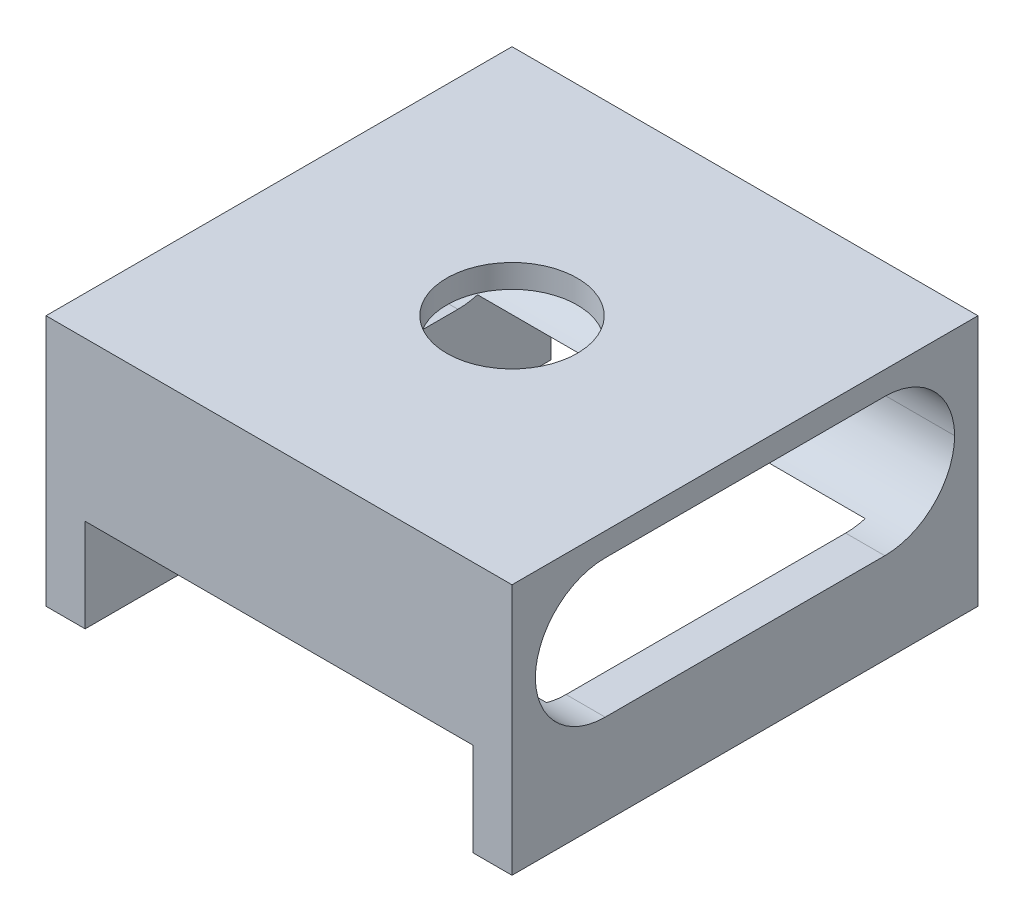
ISO-10303-21;
HEADER;
FILE_DESCRIPTION(('STEP AP214'),'2;1');
FILE_NAME('part.step','',(''),(''),'','','');
FILE_SCHEMA(('AUTOMOTIVE_DESIGN { 1 0 10303 214 1 1 1 1 }'));
ENDSEC;
DATA;
#1=APPLICATION_CONTEXT('core data for automotive mechanical design processes');
#2=APPLICATION_PROTOCOL_DEFINITION('international standard','automotive_design',2000,#1);
#3=PRODUCT_CONTEXT('',#1,'mechanical');
#4=PRODUCT('Part','Part','',(#3));
#5=PRODUCT_RELATED_PRODUCT_CATEGORY('part','',(#4));
#6=PRODUCT_DEFINITION_FORMATION('','',#4);
#7=PRODUCT_DEFINITION_CONTEXT('part definition',#1,'design');
#8=PRODUCT_DEFINITION('design','',#6,#7);
#9=PRODUCT_DEFINITION_SHAPE('','',#8);
#10=(LENGTH_UNIT() NAMED_UNIT(*) SI_UNIT(.MILLI.,.METRE.));
#11=(NAMED_UNIT(*) PLANE_ANGLE_UNIT() SI_UNIT($,.RADIAN.));
#12=(NAMED_UNIT(*) SI_UNIT($,.STERADIAN.) SOLID_ANGLE_UNIT());
#13=UNCERTAINTY_MEASURE_WITH_UNIT(LENGTH_MEASURE(1.E-05),#10,'distance_accuracy_value','');
#14=(GEOMETRIC_REPRESENTATION_CONTEXT(3) GLOBAL_UNCERTAINTY_ASSIGNED_CONTEXT((#13)) GLOBAL_UNIT_ASSIGNED_CONTEXT((#10,
#11,#12)) REPRESENTATION_CONTEXT('',''));
#15=CARTESIAN_POINT('',(0.,0.,0.));
#16=DIRECTION('',(0.,0.,1.));
#17=DIRECTION('',(1.,0.,0.));
#18=AXIS2_PLACEMENT_3D('',#15,#16,#17);
#19=CARTESIAN_POINT('',(2.667,6.35,-31.75));
#20=DIRECTION('',(0.,1.,0.));
#21=DIRECTION('',(-1.,0.,0.));
#22=AXIS2_PLACEMENT_3D('',#19,#20,#21);
#23=PLANE('',#22);
#24=DIRECTION('',(0.,0.,1.));
#25=VECTOR('',#24,1.);
#26=CARTESIAN_POINT('',(29.083,6.35,-31.75));
#27=LINE('',#26,#25);
#28=CARTESIAN_POINT('',(29.083,6.35,-31.75));
#29=VERTEX_POINT('',#28);
#30=CARTESIAN_POINT('',(29.083,6.35,-26.7335));
#31=VERTEX_POINT('',#30);
#32=EDGE_CURVE('E356',#29,#31,#27,.T.);
#33=ORIENTED_EDGE('',*,*,#32,.T.);
#34=DIRECTION('',(1.,0.,0.));
#35=VECTOR('',#34,1.);
#36=CARTESIAN_POINT('',(29.083,6.35,-26.7335));
#37=LINE('',#36,#35);
#38=CARTESIAN_POINT('',(2.667,6.35,-26.7335));
#39=VERTEX_POINT('',#38);
#40=EDGE_CURVE('E256',#31,#39,#37,.F.);
#41=ORIENTED_EDGE('',*,*,#40,.T.);
#42=DIRECTION('',(0.,0.,1.));
#43=VECTOR('',#42,1.);
#44=CARTESIAN_POINT('',(2.667,6.35,-31.75));
#45=LINE('',#44,#43);
#46=CARTESIAN_POINT('',(2.667,6.35,-31.75));
#47=VERTEX_POINT('',#46);
#48=EDGE_CURVE('E352',#47,#39,#45,.T.);
#49=ORIENTED_EDGE('',*,*,#48,.F.);
#50=DIRECTION('',(-1.,0.,0.));
#51=VECTOR('',#50,1.);
#52=CARTESIAN_POINT('',(2.667,6.35,-31.75));
#53=LINE('',#52,#51);
#54=EDGE_CURVE('E178',#29,#47,#53,.T.);
#55=ORIENTED_EDGE('',*,*,#54,.F.);
#56=EDGE_LOOP('',(#33,#41,#49,#55));
#57=FACE_BOUND('',#56,.T.);
#58=ADVANCED_FACE('F39',(#57),#23,.F.);
#59=CARTESIAN_POINT('',(0.,0.,0.));
#60=DIRECTION('',(0.,-1.,0.));
#61=DIRECTION('',(0.,0.,-1.));
#62=AXIS2_PLACEMENT_3D('',#59,#60,#61);
#63=PLANE('',#62);
#64=DIRECTION('',(0.,0.,1.));
#65=VECTOR('',#64,1.);
#66=CARTESIAN_POINT('',(2.667,0.,-31.75));
#67=LINE('',#66,#65);
#68=CARTESIAN_POINT('',(2.667,0.,-31.75));
#69=VERTEX_POINT('',#68);
#70=CARTESIAN_POINT('',(2.667,0.,0.));
#71=VERTEX_POINT('',#70);
#72=EDGE_CURVE('E166',#69,#71,#67,.T.);
#73=ORIENTED_EDGE('',*,*,#72,.T.);
#74=DIRECTION('',(1.,0.,0.));
#75=VECTOR('',#74,1.);
#76=CARTESIAN_POINT('',(0.,0.,0.));
#77=LINE('',#76,#75);
#78=CARTESIAN_POINT('',(0.,0.,0.));
#79=VERTEX_POINT('',#78);
#80=EDGE_CURVE('E203',#79,#71,#77,.T.);
#81=ORIENTED_EDGE('',*,*,#80,.F.);
#82=DIRECTION('',(0.,0.,1.));
#83=VECTOR('',#82,1.);
#84=CARTESIAN_POINT('',(0.,0.,0.));
#85=LINE('',#84,#83);
#86=CARTESIAN_POINT('',(0.,0.,-31.75));
#87=VERTEX_POINT('',#86);
#88=EDGE_CURVE('E194',#87,#79,#85,.T.);
#89=ORIENTED_EDGE('',*,*,#88,.F.);
#90=DIRECTION('',(-1.,0.,0.));
#91=VECTOR('',#90,1.);
#92=CARTESIAN_POINT('',(0.,0.,-31.75));
#93=LINE('',#92,#91);
#94=EDGE_CURVE('E183',#69,#87,#93,.T.);
#95=ORIENTED_EDGE('',*,*,#94,.F.);
#96=EDGE_LOOP('',(#73,#81,#89,#95));
#97=FACE_BOUND('',#96,.T.);
#98=ADVANCED_FACE('F192',(#97),#63,.T.);
#99=CARTESIAN_POINT('',(0.,17.145,0.));
#100=DIRECTION('',(1.,0.,0.));
#101=DIRECTION('',(0.,0.,-1.));
#102=AXIS2_PLACEMENT_3D('',#99,#100,#101);
#103=PLANE('',#102);
#104=CARTESIAN_POINT('',(0.,10.922,-25.4));
#105=DIRECTION('',(1.,0.,0.));
#106=DIRECTION('',(0.,0.,-1.));
#107=AXIS2_PLACEMENT_3D('',#104,#105,#106);
#108=CIRCLE('',#107,4.7625);
#109=CARTESIAN_POINT('',(0.,6.1595,-25.4));
#110=VERTEX_POINT('',#109);
#111=CARTESIAN_POINT('',(0.,10.8585,-30.1620766478502));
#112=VERTEX_POINT('',#111);
#113=EDGE_CURVE('E263',#110,#112,#108,.T.);
#114=ORIENTED_EDGE('',*,*,#113,.T.);
#115=CARTESIAN_POINT('',(0.,10.795,-25.4));
#116=DIRECTION('',(1.,0.,0.));
#117=DIRECTION('',(0.,0.,-1.));
#118=AXIS2_PLACEMENT_3D('',#115,#116,#117);
#119=CIRCLE('',#118,4.7625);
#120=CARTESIAN_POINT('',(0.,15.5575,-25.4));
#121=VERTEX_POINT('',#120);
#122=EDGE_CURVE('E49',#112,#121,#119,.T.);
#123=ORIENTED_EDGE('',*,*,#122,.T.);
#124=DIRECTION('',(0.,0.,-1.));
#125=VECTOR('',#124,1.);
#126=CARTESIAN_POINT('',(0.,15.5575,-30.1625));
#127=LINE('',#126,#125);
#128=CARTESIAN_POINT('',(0.,15.5575,-6.35));
#129=VERTEX_POINT('',#128);
#130=EDGE_CURVE('E302',#129,#121,#127,.T.);
#131=ORIENTED_EDGE('',*,*,#130,.F.);
#132=CARTESIAN_POINT('',(0.,10.795,-6.34999999999999));
#133=DIRECTION('',(1.,0.,0.));
#134=DIRECTION('',(0.,0.,-1.));
#135=AXIS2_PLACEMENT_3D('',#132,#133,#134);
#136=CIRCLE('',#135,4.7625);
#137=CARTESIAN_POINT('',(0.,10.8585,-1.58792335214982));
#138=VERTEX_POINT('',#137);
#139=EDGE_CURVE('E284',#129,#138,#136,.T.);
#140=ORIENTED_EDGE('',*,*,#139,.T.);
#141=CARTESIAN_POINT('',(0.,10.922,-6.35));
#142=DIRECTION('',(1.,0.,0.));
#143=DIRECTION('',(0.,0.,-1.));
#144=AXIS2_PLACEMENT_3D('',#141,#142,#143);
#145=CIRCLE('',#144,4.7625);
#146=CARTESIAN_POINT('',(0.,6.1595,-6.34999999999999));
#147=VERTEX_POINT('',#146);
#148=EDGE_CURVE('E269',#138,#147,#145,.T.);
#149=ORIENTED_EDGE('',*,*,#148,.T.);
#150=DIRECTION('',(0.,0.,1.));
#151=VECTOR('',#150,1.);
#152=CARTESIAN_POINT('',(0.,6.1595,-30.1625));
#153=LINE('',#152,#151);
#154=EDGE_CURVE('E294',#110,#147,#153,.T.);
#155=ORIENTED_EDGE('',*,*,#154,.F.);
#156=EDGE_LOOP('',(#114,#123,#131,#140,#149,#155));
#157=FACE_BOUND('',#156,.T.);
#158=ORIENTED_EDGE('',*,*,#88,.T.);
#159=DIRECTION('',(0.,-1.,0.));
#160=VECTOR('',#159,1.);
#161=CARTESIAN_POINT('',(0.,17.145,0.));
#162=LINE('',#161,#160);
#163=CARTESIAN_POINT('',(0.,17.145,0.));
#164=VERTEX_POINT('',#163);
#165=EDGE_CURVE('E219',#164,#79,#162,.T.);
#166=ORIENTED_EDGE('',*,*,#165,.F.);
#167=DIRECTION('',(0.,0.,1.));
#168=VECTOR('',#167,1.);
#169=CARTESIAN_POINT('',(0.,17.145,0.));
#170=LINE('',#169,#168);
#171=CARTESIAN_POINT('',(0.,17.145,-31.75));
#172=VERTEX_POINT('',#171);
#173=EDGE_CURVE('E202',#172,#164,#170,.T.);
#174=ORIENTED_EDGE('',*,*,#173,.F.);
#175=DIRECTION('',(0.,-1.,0.));
#176=VECTOR('',#175,1.);
#177=CARTESIAN_POINT('',(0.,17.145,-31.75));
#178=LINE('',#177,#176);
#179=EDGE_CURVE('E207',#172,#87,#178,.T.);
#180=ORIENTED_EDGE('',*,*,#179,.T.);
#181=EDGE_LOOP('',(#158,#166,#174,#180));
#182=FACE_BOUND('',#181,.T.);
#183=ADVANCED_FACE('F398',(#157,#182),#103,.F.);
#184=CARTESIAN_POINT('',(0.,17.145,0.));
#185=DIRECTION('',(0.,0.,-1.));
#186=DIRECTION('',(-1.,0.,0.));
#187=AXIS2_PLACEMENT_3D('',#184,#185,#186);
#188=PLANE('',#187);
#189=ORIENTED_EDGE('',*,*,#80,.T.);
#190=DIRECTION('',(0.,-1.,0.));
#191=VECTOR('',#190,1.);
#192=CARTESIAN_POINT('',(2.667,0.,0.));
#193=LINE('',#192,#191);
#194=CARTESIAN_POINT('',(2.667,6.35,0.));
#195=VERTEX_POINT('',#194);
#196=EDGE_CURVE('E172',#195,#71,#193,.T.);
#197=ORIENTED_EDGE('',*,*,#196,.F.);
#198=DIRECTION('',(-1.,0.,0.));
#199=VECTOR('',#198,1.);
#200=CARTESIAN_POINT('',(2.667,6.35,0.));
#201=LINE('',#200,#199);
#202=CARTESIAN_POINT('',(29.083,6.35,0.));
#203=VERTEX_POINT('',#202);
#204=EDGE_CURVE('E189',#203,#195,#201,.T.);
#205=ORIENTED_EDGE('',*,*,#204,.F.);
#206=DIRECTION('',(0.,1.,0.));
#207=VECTOR('',#206,1.);
#208=CARTESIAN_POINT('',(29.083,0.,0.));
#209=LINE('',#208,#207);
#210=CARTESIAN_POINT('',(29.083,0.,0.));
#211=VERTEX_POINT('',#210);
#212=EDGE_CURVE('E347',#211,#203,#209,.T.);
#213=ORIENTED_EDGE('',*,*,#212,.F.);
#214=CARTESIAN_POINT('',(31.75,0.,0.));
#215=VERTEX_POINT('',#214);
#216=EDGE_CURVE('E376',#211,#215,#77,.T.);
#217=ORIENTED_EDGE('',*,*,#216,.T.);
#218=DIRECTION('',(0.,-1.,0.));
#219=VECTOR('',#218,1.);
#220=CARTESIAN_POINT('',(31.75,17.145,0.));
#221=LINE('',#220,#219);
#222=CARTESIAN_POINT('',(31.75,17.145,0.));
#223=VERTEX_POINT('',#222);
#224=EDGE_CURVE('E215',#223,#215,#221,.T.);
#225=ORIENTED_EDGE('',*,*,#224,.F.);
#226=DIRECTION('',(1.,0.,0.));
#227=VECTOR('',#226,1.);
#228=CARTESIAN_POINT('',(0.,17.145,0.));
#229=LINE('',#228,#227);
#230=EDGE_CURVE('E367',#164,#223,#229,.T.);
#231=ORIENTED_EDGE('',*,*,#230,.F.);
#232=ORIENTED_EDGE('',*,*,#165,.T.);
#233=EDGE_LOOP('',(#189,#197,#205,#213,#217,#225,#231,#232));
#234=FACE_BOUND('',#233,.T.);
#235=ADVANCED_FACE('F383',(#234),#188,.F.);
#236=CARTESIAN_POINT('',(31.75,17.145,0.));
#237=DIRECTION('',(-1.,0.,0.));
#238=DIRECTION('',(0.,0.,1.));
#239=AXIS2_PLACEMENT_3D('',#236,#237,#238);
#240=PLANE('',#239);
#241=CARTESIAN_POINT('',(31.75,10.922,-6.35));
#242=DIRECTION('',(-1.,0.,0.));
#243=DIRECTION('',(0.,0.,1.));
#244=AXIS2_PLACEMENT_3D('',#241,#242,#243);
#245=CIRCLE('',#244,4.7625);
#246=CARTESIAN_POINT('',(31.75,6.1595,-6.34999999999999));
#247=VERTEX_POINT('',#246);
#248=CARTESIAN_POINT('',(31.75,10.8585,-1.58792335214982));
#249=VERTEX_POINT('',#248);
#250=EDGE_CURVE('E281',#247,#249,#245,.T.);
#251=ORIENTED_EDGE('',*,*,#250,.T.);
#252=CARTESIAN_POINT('',(31.75,10.795,-6.34999999999999));
#253=DIRECTION('',(-1.,0.,0.));
#254=DIRECTION('',(0.,0.,1.));
#255=AXIS2_PLACEMENT_3D('',#252,#253,#254);
#256=CIRCLE('',#255,4.7625);
#257=CARTESIAN_POINT('',(31.75,15.5575,-6.35));
#258=VERTEX_POINT('',#257);
#259=EDGE_CURVE('E287',#249,#258,#256,.T.);
#260=ORIENTED_EDGE('',*,*,#259,.T.);
#261=DIRECTION('',(0.,0.,-1.));
#262=VECTOR('',#261,1.);
#263=CARTESIAN_POINT('',(31.75,15.5575,-30.1625));
#264=LINE('',#263,#262);
#265=CARTESIAN_POINT('',(31.75,15.5575,-25.4));
#266=VERTEX_POINT('',#265);
#267=EDGE_CURVE('E321',#258,#266,#264,.T.);
#268=ORIENTED_EDGE('',*,*,#267,.T.);
#269=CARTESIAN_POINT('',(31.75,10.795,-25.4));
#270=DIRECTION('',(-1.,0.,0.));
#271=DIRECTION('',(0.,0.,1.));
#272=AXIS2_PLACEMENT_3D('',#269,#270,#271);
#273=CIRCLE('',#272,4.7625);
#274=CARTESIAN_POINT('',(31.75,10.8585,-30.1620766478502));
#275=VERTEX_POINT('',#274);
#276=EDGE_CURVE('E11',#266,#275,#273,.T.);
#277=ORIENTED_EDGE('',*,*,#276,.T.);
#278=CARTESIAN_POINT('',(31.75,10.922,-25.4));
#279=DIRECTION('',(-1.,0.,0.));
#280=DIRECTION('',(0.,0.,1.));
#281=AXIS2_PLACEMENT_3D('',#278,#279,#280);
#282=CIRCLE('',#281,4.7625);
#283=CARTESIAN_POINT('',(31.75,6.1595,-25.4));
#284=VERTEX_POINT('',#283);
#285=EDGE_CURVE('E266',#275,#284,#282,.T.);
#286=ORIENTED_EDGE('',*,*,#285,.T.);
#287=DIRECTION('',(0.,0.,1.));
#288=VECTOR('',#287,1.);
#289=CARTESIAN_POINT('',(31.75,6.1595,-30.1625));
#290=LINE('',#289,#288);
#291=EDGE_CURVE('E331',#284,#247,#290,.T.);
#292=ORIENTED_EDGE('',*,*,#291,.T.);
#293=EDGE_LOOP('',(#251,#260,#268,#277,#286,#292));
#294=FACE_BOUND('',#293,.T.);
#295=DIRECTION('',(0.,0.,-1.));
#296=VECTOR('',#295,1.);
#297=CARTESIAN_POINT('',(31.75,0.,0.));
#298=LINE('',#297,#296);
#299=CARTESIAN_POINT('',(31.75,0.,-31.75));
#300=VERTEX_POINT('',#299);
#301=EDGE_CURVE('E197',#215,#300,#298,.T.);
#302=ORIENTED_EDGE('',*,*,#301,.T.);
#303=DIRECTION('',(0.,-1.,0.));
#304=VECTOR('',#303,1.);
#305=CARTESIAN_POINT('',(31.75,17.145,-31.75));
#306=LINE('',#305,#304);
#307=CARTESIAN_POINT('',(31.75,17.145,-31.75));
#308=VERTEX_POINT('',#307);
#309=EDGE_CURVE('E210',#308,#300,#306,.T.);
#310=ORIENTED_EDGE('',*,*,#309,.F.);
#311=DIRECTION('',(0.,0.,-1.));
#312=VECTOR('',#311,1.);
#313=CARTESIAN_POINT('',(31.75,17.145,0.));
#314=LINE('',#313,#312);
#315=EDGE_CURVE('E370',#223,#308,#314,.T.);
#316=ORIENTED_EDGE('',*,*,#315,.F.);
#317=ORIENTED_EDGE('',*,*,#224,.T.);
#318=EDGE_LOOP('',(#302,#310,#316,#317));
#319=FACE_BOUND('',#318,.T.);
#320=ADVANCED_FACE('F319',(#294,#319),#240,.F.);
#321=CARTESIAN_POINT('',(0.,17.145,-31.75));
#322=DIRECTION('',(0.,0.,1.));
#323=DIRECTION('',(1.,0.,0.));
#324=AXIS2_PLACEMENT_3D('',#321,#322,#323);
#325=PLANE('',#324);
#326=ORIENTED_EDGE('',*,*,#54,.T.);
#327=DIRECTION('',(0.,-1.,0.));
#328=VECTOR('',#327,1.);
#329=CARTESIAN_POINT('',(2.667,0.,-31.75));
#330=LINE('',#329,#328);
#331=EDGE_CURVE('E169',#47,#69,#330,.T.);
#332=ORIENTED_EDGE('',*,*,#331,.T.);
#333=ORIENTED_EDGE('',*,*,#94,.T.);
#334=ORIENTED_EDGE('',*,*,#179,.F.);
#335=DIRECTION('',(-1.,0.,0.));
#336=VECTOR('',#335,1.);
#337=CARTESIAN_POINT('',(0.,17.145,-31.75));
#338=LINE('',#337,#336);
#339=EDGE_CURVE('E211',#308,#172,#338,.T.);
#340=ORIENTED_EDGE('',*,*,#339,.F.);
#341=ORIENTED_EDGE('',*,*,#309,.T.);
#342=CARTESIAN_POINT('',(29.083,0.,-31.75));
#343=VERTEX_POINT('',#342);
#344=EDGE_CURVE('E196',#300,#343,#93,.T.);
#345=ORIENTED_EDGE('',*,*,#344,.T.);
#346=DIRECTION('',(0.,1.,0.));
#347=VECTOR('',#346,1.);
#348=CARTESIAN_POINT('',(29.083,0.,-31.75));
#349=LINE('',#348,#347);
#350=EDGE_CURVE('E188',#343,#29,#349,.T.);
#351=ORIENTED_EDGE('',*,*,#350,.T.);
#352=EDGE_LOOP('',(#326,#332,#333,#334,#340,#341,#345,#351));
#353=FACE_BOUND('',#352,.T.);
#354=ADVANCED_FACE('F181',(#353),#325,.F.);
#355=CARTESIAN_POINT('',(0.,17.145,0.));
#356=DIRECTION('',(0.,-1.,0.));
#357=DIRECTION('',(0.,0.,-1.));
#358=AXIS2_PLACEMENT_3D('',#355,#356,#357);
#359=PLANE('',#358);
#360=CARTESIAN_POINT('',(15.875,17.145,-15.875));
#361=DIRECTION('',(0.,1.,0.));
#362=DIRECTION('',(0.,0.,1.));
#363=AXIS2_PLACEMENT_3D('',#360,#361,#362);
#364=CIRCLE('',#363,4.44499999999999);
#365=CARTESIAN_POINT('',(15.875,17.145,-11.43));
#366=VERTEX_POINT('',#365);
#367=EDGE_CURVE('E355',#366,#366,#364,.T.);
#368=ORIENTED_EDGE('',*,*,#367,.F.);
#369=EDGE_LOOP('',(#368));
#370=FACE_BOUND('',#369,.T.);
#371=ORIENTED_EDGE('',*,*,#173,.T.);
#372=ORIENTED_EDGE('',*,*,#230,.T.);
#373=ORIENTED_EDGE('',*,*,#315,.T.);
#374=ORIENTED_EDGE('',*,*,#339,.T.);
#375=EDGE_LOOP('',(#371,#372,#373,#374));
#376=FACE_BOUND('',#375,.T.);
#377=ADVANCED_FACE('F395',(#370,#376),#359,.F.);
#378=DIRECTION('',(0.,0.,1.));
#379=VECTOR('',#378,1.);
#380=CARTESIAN_POINT('',(29.083,0.,-31.75));
#381=LINE('',#380,#379);
#382=EDGE_CURVE('E177',#343,#211,#381,.T.);
#383=ORIENTED_EDGE('',*,*,#382,.F.);
#384=ORIENTED_EDGE('',*,*,#344,.F.);
#385=ORIENTED_EDGE('',*,*,#301,.F.);
#386=ORIENTED_EDGE('',*,*,#216,.F.);
#387=EDGE_LOOP('',(#383,#384,#385,#386));
#388=FACE_BOUND('',#387,.T.);
#389=ADVANCED_FACE('F391',(#388),#63,.T.);
#390=CARTESIAN_POINT('',(15.875,0.,-15.875));
#391=DIRECTION('',(0.,1.,0.));
#392=DIRECTION('',(0.,0.,1.));
#393=AXIS2_PLACEMENT_3D('',#390,#391,#392);
#394=CYLINDRICAL_SURFACE('',#393,4.44499999999999);
#395=CARTESIAN_POINT('',(15.875,15.5575,-15.875));
#396=DIRECTION('',(0.,1.,0.));
#397=DIRECTION('',(0.,0.,1.));
#398=AXIS2_PLACEMENT_3D('',#395,#396,#397);
#399=CIRCLE('',#398,4.44499999999999);
#400=CARTESIAN_POINT('',(15.875,15.5575,-11.43));
#401=VERTEX_POINT('',#400);
#402=EDGE_CURVE('E228',#401,#401,#399,.F.);
#403=ORIENTED_EDGE('',*,*,#402,.T.);
#404=EDGE_LOOP('',(#403));
#405=FACE_BOUND('',#404,.T.);
#406=ORIENTED_EDGE('',*,*,#367,.T.);
#407=EDGE_LOOP('',(#406));
#408=FACE_BOUND('',#407,.T.);
#409=ADVANCED_FACE('F418',(#405,#408),#394,.F.);
#410=CARTESIAN_POINT('',(2.667,6.35,-5.01650000000001));
#411=VERTEX_POINT('',#410);
#412=EDGE_CURVE('E64',#411,#195,#45,.T.);
#413=ORIENTED_EDGE('',*,*,#412,.F.);
#414=DIRECTION('',(1.,0.,0.));
#415=VECTOR('',#414,1.);
#416=CARTESIAN_POINT('',(2.667,6.35,-5.01650000000001));
#417=LINE('',#416,#415);
#418=CARTESIAN_POINT('',(29.083,6.35,-5.0165));
#419=VERTEX_POINT('',#418);
#420=EDGE_CURVE('E275',#411,#419,#417,.T.);
#421=ORIENTED_EDGE('',*,*,#420,.T.);
#422=EDGE_CURVE('E57',#419,#203,#27,.T.);
#423=ORIENTED_EDGE('',*,*,#422,.T.);
#424=ORIENTED_EDGE('',*,*,#204,.T.);
#425=EDGE_LOOP('',(#413,#421,#423,#424));
#426=FACE_BOUND('',#425,.T.);
#427=ADVANCED_FACE('F412',(#426),#23,.F.);
#428=CARTESIAN_POINT('',(2.667,0.,-31.75));
#429=DIRECTION('',(-1.,0.,0.));
#430=DIRECTION('',(0.,0.,1.));
#431=AXIS2_PLACEMENT_3D('',#428,#429,#430);
#432=PLANE('',#431);
#433=ORIENTED_EDGE('',*,*,#48,.T.);
#434=CARTESIAN_POINT('',(2.667,10.922,-25.4));
#435=DIRECTION('',(-1.,0.,0.));
#436=DIRECTION('',(0.,0.,1.));
#437=AXIS2_PLACEMENT_3D('',#434,#435,#436);
#438=CIRCLE('',#437,4.7625);
#439=CARTESIAN_POINT('',(2.667,6.1595,-25.4));
#440=VERTEX_POINT('',#439);
#441=EDGE_CURVE('E260',#39,#440,#438,.T.);
#442=ORIENTED_EDGE('',*,*,#441,.T.);
#443=DIRECTION('',(0.,0.,1.));
#444=VECTOR('',#443,1.);
#445=CARTESIAN_POINT('',(2.667,6.1595,-31.75));
#446=LINE('',#445,#444);
#447=CARTESIAN_POINT('',(2.667,6.1595,-6.34999999999999));
#448=VERTEX_POINT('',#447);
#449=EDGE_CURVE('E232',#440,#448,#446,.T.);
#450=ORIENTED_EDGE('',*,*,#449,.T.);
#451=CARTESIAN_POINT('',(2.667,10.922,-6.35));
#452=DIRECTION('',(-1.,0.,0.));
#453=DIRECTION('',(0.,0.,1.));
#454=AXIS2_PLACEMENT_3D('',#451,#452,#453);
#455=CIRCLE('',#454,4.7625);
#456=EDGE_CURVE('E272',#448,#411,#455,.T.);
#457=ORIENTED_EDGE('',*,*,#456,.T.);
#458=ORIENTED_EDGE('',*,*,#412,.T.);
#459=ORIENTED_EDGE('',*,*,#196,.T.);
#460=ORIENTED_EDGE('',*,*,#72,.F.);
#461=ORIENTED_EDGE('',*,*,#331,.F.);
#462=EDGE_LOOP('',(#433,#442,#450,#457,#458,#459,#460,#461));
#463=FACE_BOUND('',#462,.T.);
#464=ADVANCED_FACE('F168',(#463),#432,.F.);
#465=CARTESIAN_POINT('',(29.083,0.,-31.75));
#466=DIRECTION('',(1.,0.,0.));
#467=DIRECTION('',(0.,0.,-1.));
#468=AXIS2_PLACEMENT_3D('',#465,#466,#467);
#469=PLANE('',#468);
#470=ORIENTED_EDGE('',*,*,#422,.F.);
#471=CARTESIAN_POINT('',(29.083,10.922,-6.35));
#472=DIRECTION('',(1.,0.,0.));
#473=DIRECTION('',(0.,0.,-1.));
#474=AXIS2_PLACEMENT_3D('',#471,#472,#473);
#475=CIRCLE('',#474,4.7625);
#476=CARTESIAN_POINT('',(29.083,6.1595,-6.34999999999999));
#477=VERTEX_POINT('',#476);
#478=EDGE_CURVE('E278',#419,#477,#475,.T.);
#479=ORIENTED_EDGE('',*,*,#478,.T.);
#480=DIRECTION('',(0.,0.,-1.));
#481=VECTOR('',#480,1.);
#482=CARTESIAN_POINT('',(29.083,6.1595,-31.75));
#483=LINE('',#482,#481);
#484=CARTESIAN_POINT('',(29.083,6.1595,-25.4));
#485=VERTEX_POINT('',#484);
#486=EDGE_CURVE('E223',#477,#485,#483,.T.);
#487=ORIENTED_EDGE('',*,*,#486,.T.);
#488=CARTESIAN_POINT('',(29.083,10.922,-25.4));
#489=DIRECTION('',(1.,0.,0.));
#490=DIRECTION('',(0.,0.,-1.));
#491=AXIS2_PLACEMENT_3D('',#488,#489,#490);
#492=CIRCLE('',#491,4.7625);
#493=EDGE_CURVE('E252',#485,#31,#492,.T.);
#494=ORIENTED_EDGE('',*,*,#493,.T.);
#495=ORIENTED_EDGE('',*,*,#32,.F.);
#496=ORIENTED_EDGE('',*,*,#350,.F.);
#497=ORIENTED_EDGE('',*,*,#382,.T.);
#498=ORIENTED_EDGE('',*,*,#212,.T.);
#499=EDGE_LOOP('',(#470,#479,#487,#494,#495,#496,#497,#498));
#500=FACE_BOUND('',#499,.T.);
#501=ADVANCED_FACE('F423',(#500),#469,.F.);
#502=CARTESIAN_POINT('',(31.75,15.5575,-30.1625));
#503=DIRECTION('',(0.,1.,0.));
#504=DIRECTION('',(0.,0.,1.));
#505=AXIS2_PLACEMENT_3D('',#502,#503,#504);
#506=PLANE('',#505);
#507=ORIENTED_EDGE('',*,*,#267,.F.);
#508=DIRECTION('',(-1.,0.,0.));
#509=VECTOR('',#508,1.);
#510=CARTESIAN_POINT('',(0.,15.5575,-6.35));
#511=LINE('',#510,#509);
#512=EDGE_CURVE('E249',#258,#129,#511,.T.);
#513=ORIENTED_EDGE('',*,*,#512,.T.);
#514=ORIENTED_EDGE('',*,*,#130,.T.);
#515=DIRECTION('',(-1.,0.,0.));
#516=VECTOR('',#515,1.);
#517=CARTESIAN_POINT('',(31.75,15.5575,-25.4));
#518=LINE('',#517,#516);
#519=EDGE_CURVE('E246',#121,#266,#518,.F.);
#520=ORIENTED_EDGE('',*,*,#519,.T.);
#521=EDGE_LOOP('',(#507,#513,#514,#520));
#522=FACE_BOUND('',#521,.T.);
#523=ORIENTED_EDGE('',*,*,#402,.F.);
#524=EDGE_LOOP('',(#523));
#525=FACE_BOUND('',#524,.T.);
#526=ADVANCED_FACE('F325',(#522,#525),#506,.F.);
#527=CARTESIAN_POINT('',(31.75,6.1595,-30.1625));
#528=DIRECTION('',(0.,-1.,0.));
#529=DIRECTION('',(0.,0.,-1.));
#530=AXIS2_PLACEMENT_3D('',#527,#528,#529);
#531=PLANE('',#530);
#532=ORIENTED_EDGE('',*,*,#449,.F.);
#533=DIRECTION('',(1.,0.,0.));
#534=VECTOR('',#533,1.);
#535=CARTESIAN_POINT('',(1.3335,6.1595,-25.4));
#536=LINE('',#535,#534);
#537=EDGE_CURVE('E243',#440,#110,#536,.F.);
#538=ORIENTED_EDGE('',*,*,#537,.T.);
#539=ORIENTED_EDGE('',*,*,#154,.T.);
#540=DIRECTION('',(-1.,0.,0.));
#541=VECTOR('',#540,1.);
#542=CARTESIAN_POINT('',(2.667,6.1595,-6.34999999999999));
#543=LINE('',#542,#541);
#544=EDGE_CURVE('E239',#147,#448,#543,.F.);
#545=ORIENTED_EDGE('',*,*,#544,.T.);
#546=EDGE_LOOP('',(#532,#538,#539,#545));
#547=FACE_BOUND('',#546,.T.);
#548=ADVANCED_FACE('F507',(#547),#531,.F.);
#549=ORIENTED_EDGE('',*,*,#291,.F.);
#550=DIRECTION('',(-1.,0.,0.));
#551=VECTOR('',#550,1.);
#552=CARTESIAN_POINT('',(29.083,6.1595,-25.4));
#553=LINE('',#552,#551);
#554=EDGE_CURVE('E235',#284,#485,#553,.T.);
#555=ORIENTED_EDGE('',*,*,#554,.T.);
#556=ORIENTED_EDGE('',*,*,#486,.F.);
#557=DIRECTION('',(1.,0.,0.));
#558=VECTOR('',#557,1.);
#559=CARTESIAN_POINT('',(30.4165,6.1595,-6.34999999999999));
#560=LINE('',#559,#558);
#561=EDGE_CURVE('E227',#477,#247,#560,.T.);
#562=ORIENTED_EDGE('',*,*,#561,.T.);
#563=EDGE_LOOP('',(#549,#555,#556,#562));
#564=FACE_BOUND('',#563,.T.);
#565=ADVANCED_FACE('F516',(#564),#531,.F.);
#566=CARTESIAN_POINT('',(31.75,10.795,-25.4));
#567=DIRECTION('',(1.,0.,0.));
#568=DIRECTION('',(0.,0.,-1.));
#569=AXIS2_PLACEMENT_3D('',#566,#567,#568);
#570=CYLINDRICAL_SURFACE('',#569,4.7625);
#571=DIRECTION('',(1.,0.,0.));
#572=VECTOR('',#571,1.);
#573=CARTESIAN_POINT('',(15.875,10.8585,-30.1620766478502));
#574=LINE('',#573,#572);
#575=EDGE_CURVE('E291',#275,#112,#574,.F.);
#576=ORIENTED_EDGE('',*,*,#575,.F.);
#577=ORIENTED_EDGE('',*,*,#276,.F.);
#578=ORIENTED_EDGE('',*,*,#519,.F.);
#579=ORIENTED_EDGE('',*,*,#122,.F.);
#580=EDGE_LOOP('',(#576,#577,#578,#579));
#581=FACE_BOUND('',#580,.T.);
#582=ADVANCED_FACE('F525',(#581),#570,.F.);
#583=CARTESIAN_POINT('',(31.75,10.922,-25.4));
#584=DIRECTION('',(1.,0.,0.));
#585=DIRECTION('',(0.,0.,-1.));
#586=AXIS2_PLACEMENT_3D('',#583,#584,#585);
#587=CYLINDRICAL_SURFACE('',#586,4.7625);
#588=ORIENTED_EDGE('',*,*,#285,.F.);
#589=ORIENTED_EDGE('',*,*,#575,.T.);
#590=ORIENTED_EDGE('',*,*,#113,.F.);
#591=ORIENTED_EDGE('',*,*,#537,.F.);
#592=ORIENTED_EDGE('',*,*,#441,.F.);
#593=ORIENTED_EDGE('',*,*,#40,.F.);
#594=ORIENTED_EDGE('',*,*,#493,.F.);
#595=ORIENTED_EDGE('',*,*,#554,.F.);
#596=EDGE_LOOP('',(#588,#589,#590,#591,#592,#593,#594,#595));
#597=FACE_BOUND('',#596,.T.);
#598=ADVANCED_FACE('F534',(#597),#587,.F.);
#599=CARTESIAN_POINT('',(31.75,10.795,-6.34999999999999));
#600=DIRECTION('',(1.,0.,0.));
#601=DIRECTION('',(0.,0.,-1.));
#602=AXIS2_PLACEMENT_3D('',#599,#600,#601);
#603=CYLINDRICAL_SURFACE('',#602,4.7625);
#604=ORIENTED_EDGE('',*,*,#512,.F.);
#605=ORIENTED_EDGE('',*,*,#259,.F.);
#606=DIRECTION('',(1.,0.,0.));
#607=VECTOR('',#606,1.);
#608=CARTESIAN_POINT('',(15.875,10.8585,-1.58792335214982));
#609=LINE('',#608,#607);
#610=EDGE_CURVE('E43',#138,#249,#609,.T.);
#611=ORIENTED_EDGE('',*,*,#610,.F.);
#612=ORIENTED_EDGE('',*,*,#139,.F.);
#613=EDGE_LOOP('',(#604,#605,#611,#612));
#614=FACE_BOUND('',#613,.T.);
#615=ADVANCED_FACE('F41',(#614),#603,.F.);
#616=CARTESIAN_POINT('',(31.75,10.922,-6.35));
#617=DIRECTION('',(1.,0.,0.));
#618=DIRECTION('',(0.,0.,-1.));
#619=AXIS2_PLACEMENT_3D('',#616,#617,#618);
#620=CYLINDRICAL_SURFACE('',#619,4.7625);
#621=ORIENTED_EDGE('',*,*,#456,.F.);
#622=ORIENTED_EDGE('',*,*,#544,.F.);
#623=ORIENTED_EDGE('',*,*,#148,.F.);
#624=ORIENTED_EDGE('',*,*,#610,.T.);
#625=ORIENTED_EDGE('',*,*,#250,.F.);
#626=ORIENTED_EDGE('',*,*,#561,.F.);
#627=ORIENTED_EDGE('',*,*,#478,.F.);
#628=ORIENTED_EDGE('',*,*,#420,.F.);
#629=EDGE_LOOP('',(#621,#622,#623,#624,#625,#626,#627,#628));
#630=FACE_BOUND('',#629,.T.);
#631=ADVANCED_FACE('F309',(#630),#620,.F.);
#632=CLOSED_SHELL('',(#58,#98,#183,#235,#320,#354,#377,#389,#409,#427,#464,#501,#526,#548,#565,
#582,#598,#615,#631));
#633=MANIFOLD_SOLID_BREP('B2',#632);
#634=ADVANCED_BREP_SHAPE_REPRESENTATION('',(#18,#633),#14);
#635=SHAPE_DEFINITION_REPRESENTATION(#9,#634);
ENDSEC;
END-ISO-10303-21;
